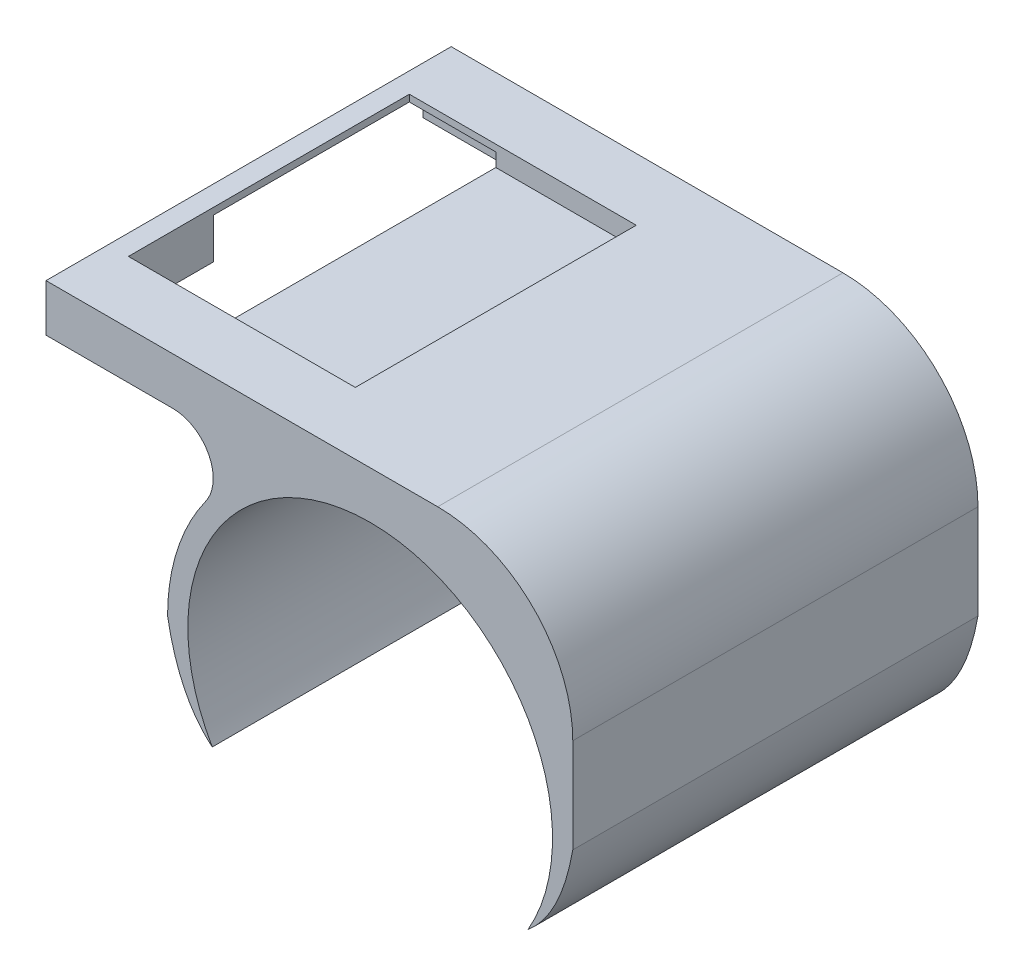
ISO-10303-21;
HEADER;
FILE_DESCRIPTION(('STEP AP214'),'2;1');
FILE_NAME('part.step','',(''),(''),'','','');
FILE_SCHEMA(('AUTOMOTIVE_DESIGN { 1 0 10303 214 1 1 1 1 }'));
ENDSEC;
DATA;
#1=APPLICATION_CONTEXT('core data for automotive mechanical design processes');
#2=APPLICATION_PROTOCOL_DEFINITION('international standard','automotive_design',2000,#1);
#3=PRODUCT_CONTEXT('',#1,'mechanical');
#4=PRODUCT('Part','Part','',(#3));
#5=PRODUCT_RELATED_PRODUCT_CATEGORY('part','',(#4));
#6=PRODUCT_DEFINITION_FORMATION('','',#4);
#7=PRODUCT_DEFINITION_CONTEXT('part definition',#1,'design');
#8=PRODUCT_DEFINITION('design','',#6,#7);
#9=PRODUCT_DEFINITION_SHAPE('','',#8);
#10=(LENGTH_UNIT() NAMED_UNIT(*) SI_UNIT(.MILLI.,.METRE.));
#11=(NAMED_UNIT(*) PLANE_ANGLE_UNIT() SI_UNIT($,.RADIAN.));
#12=(NAMED_UNIT(*) SI_UNIT($,.STERADIAN.) SOLID_ANGLE_UNIT());
#13=UNCERTAINTY_MEASURE_WITH_UNIT(LENGTH_MEASURE(1.E-05),#10,'distance_accuracy_value','');
#14=(GEOMETRIC_REPRESENTATION_CONTEXT(3) GLOBAL_UNCERTAINTY_ASSIGNED_CONTEXT((#13)) GLOBAL_UNIT_ASSIGNED_CONTEXT((#10,
#11,#12)) REPRESENTATION_CONTEXT('',''));
#15=CARTESIAN_POINT('',(0.,0.,0.));
#16=DIRECTION('',(0.,0.,1.));
#17=DIRECTION('',(1.,0.,0.));
#18=AXIS2_PLACEMENT_3D('',#15,#16,#17);
#19=CARTESIAN_POINT('',(-24.,0.,0.));
#20=DIRECTION('',(-1.,0.,0.));
#21=DIRECTION('',(0.,0.,1.));
#22=AXIS2_PLACEMENT_3D('',#19,#20,#21);
#23=PLANE('',#22);
#24=DIRECTION('',(0.,0.,1.));
#25=VECTOR('',#24,1.);
#26=CARTESIAN_POINT('',(-24.,13.5,0.));
#27=LINE('',#26,#25);
#28=CARTESIAN_POINT('',(-24.,13.5,0.));
#29=VERTEX_POINT('',#28);
#30=CARTESIAN_POINT('',(-24.,13.5,2.1));
#31=VERTEX_POINT('',#30);
#32=EDGE_CURVE('E263',#29,#31,#27,.T.);
#33=ORIENTED_EDGE('',*,*,#32,.T.);
#34=DIRECTION('',(0.,-1.,0.));
#35=VECTOR('',#34,1.);
#36=CARTESIAN_POINT('',(-24.,16.5,2.1));
#37=LINE('',#36,#35);
#38=CARTESIAN_POINT('',(-24.,16.5,2.1));
#39=VERTEX_POINT('',#38);
#40=EDGE_CURVE('E210',#39,#31,#37,.T.);
#41=ORIENTED_EDGE('',*,*,#40,.F.);
#42=DIRECTION('',(0.,0.,-1.));
#43=VECTOR('',#42,1.);
#44=CARTESIAN_POINT('',(-24.,16.5,0.));
#45=LINE('',#44,#43);
#46=CARTESIAN_POINT('',(-24.,16.5,19.1));
#47=VERTEX_POINT('',#46);
#48=EDGE_CURVE('E193',#47,#39,#45,.T.);
#49=ORIENTED_EDGE('',*,*,#48,.F.);
#50=DIRECTION('',(0.,-1.,0.));
#51=VECTOR('',#50,1.);
#52=CARTESIAN_POINT('',(-24.,16.5,19.1));
#53=LINE('',#52,#51);
#54=CARTESIAN_POINT('',(-24.,13.5,19.1));
#55=VERTEX_POINT('',#54);
#56=EDGE_CURVE('E213',#47,#55,#53,.T.);
#57=ORIENTED_EDGE('',*,*,#56,.T.);
#58=CARTESIAN_POINT('',(-24.,13.5,30.));
#59=VERTEX_POINT('',#58);
#60=EDGE_CURVE('E262',#55,#59,#27,.T.);
#61=ORIENTED_EDGE('',*,*,#60,.T.);
#62=DIRECTION('',(0.,1.,0.));
#63=VECTOR('',#62,1.);
#64=CARTESIAN_POINT('',(-24.,17.,30.));
#65=LINE('',#64,#63);
#66=CARTESIAN_POINT('',(-24.,17.,30.));
#67=VERTEX_POINT('',#66);
#68=EDGE_CURVE('E266',#59,#67,#65,.T.);
#69=ORIENTED_EDGE('',*,*,#68,.T.);
#70=DIRECTION('',(0.,0.,-1.));
#71=VECTOR('',#70,1.);
#72=CARTESIAN_POINT('',(-24.,17.,0.));
#73=LINE('',#72,#71);
#74=CARTESIAN_POINT('',(-24.,17.,0.));
#75=VERTEX_POINT('',#74);
#76=EDGE_CURVE('E269',#67,#75,#73,.T.);
#77=ORIENTED_EDGE('',*,*,#76,.T.);
#78=DIRECTION('',(0.,-1.,0.));
#79=VECTOR('',#78,1.);
#80=CARTESIAN_POINT('',(-24.,17.,0.));
#81=LINE('',#80,#79);
#82=EDGE_CURVE('E259',#75,#29,#81,.T.);
#83=ORIENTED_EDGE('',*,*,#82,.T.);
#84=EDGE_LOOP('',(#33,#41,#49,#57,#61,#69,#77,#83));
#85=FACE_BOUND('',#84,.T.);
#86=ADVANCED_FACE('F41',(#85),#23,.T.);
#87=CARTESIAN_POINT('',(0.,0.,4.6));
#88=DIRECTION('',(0.,0.,1.));
#89=DIRECTION('',(1.,0.,0.));
#90=AXIS2_PLACEMENT_3D('',#87,#88,#89);
#91=PLANE('',#90);
#92=DIRECTION('',(-1.,0.,0.));
#93=VECTOR('',#92,1.);
#94=CARTESIAN_POINT('',(0.,16.5,4.6));
#95=LINE('',#94,#93);
#96=CARTESIAN_POINT('',(-16.1,16.5,4.6));
#97=VERTEX_POINT('',#96);
#98=CARTESIAN_POINT('',(-22.5,16.5,4.6));
#99=VERTEX_POINT('',#98);
#100=EDGE_CURVE('E56',#97,#99,#95,.T.);
#101=ORIENTED_EDGE('',*,*,#100,.F.);
#102=DIRECTION('',(0.,-1.,0.));
#103=VECTOR('',#102,1.);
#104=CARTESIAN_POINT('',(-16.1,16.5,4.6));
#105=LINE('',#104,#103);
#106=CARTESIAN_POINT('',(-16.1,15.5,4.6));
#107=VERTEX_POINT('',#106);
#108=EDGE_CURVE('E184',#97,#107,#105,.T.);
#109=ORIENTED_EDGE('',*,*,#108,.T.);
#110=DIRECTION('',(1.,0.,0.));
#111=VECTOR('',#110,1.);
#112=CARTESIAN_POINT('',(-16.1,15.5,4.6));
#113=LINE('',#112,#111);
#114=CARTESIAN_POINT('',(-5.7,15.5,4.6));
#115=VERTEX_POINT('',#114);
#116=EDGE_CURVE('E229',#107,#115,#113,.T.);
#117=ORIENTED_EDGE('',*,*,#116,.T.);
#118=DIRECTION('',(0.,1.,0.));
#119=VECTOR('',#118,1.);
#120=CARTESIAN_POINT('',(-5.7,15.5,4.6));
#121=LINE('',#120,#119);
#122=CARTESIAN_POINT('',(-5.7,17.,4.6));
#123=VERTEX_POINT('',#122);
#124=EDGE_CURVE('E232',#115,#123,#121,.T.);
#125=ORIENTED_EDGE('',*,*,#124,.T.);
#126=DIRECTION('',(-1.,0.,0.));
#127=VECTOR('',#126,1.);
#128=CARTESIAN_POINT('',(-5.7,17.,4.6));
#129=LINE('',#128,#127);
#130=CARTESIAN_POINT('',(-22.5,17.,4.6));
#131=VERTEX_POINT('',#130);
#132=EDGE_CURVE('E235',#123,#131,#129,.T.);
#133=ORIENTED_EDGE('',*,*,#132,.T.);
#134=DIRECTION('',(0.,1.,0.));
#135=VECTOR('',#134,1.);
#136=CARTESIAN_POINT('',(-22.5,17.,4.6));
#137=LINE('',#136,#135);
#138=EDGE_CURVE('E224',#99,#131,#137,.T.);
#139=ORIENTED_EDGE('',*,*,#138,.F.);
#140=EDGE_LOOP('',(#101,#109,#117,#125,#133,#139));
#141=FACE_BOUND('',#140,.T.);
#142=ADVANCED_FACE('F329',(#141),#91,.T.);
#143=CARTESIAN_POINT('',(0.,15.5,0.));
#144=DIRECTION('',(0.,1.,0.));
#145=DIRECTION('',(0.,0.,1.));
#146=AXIS2_PLACEMENT_3D('',#143,#144,#145);
#147=PLANE('',#146);
#148=DIRECTION('',(0.,0.,-1.));
#149=VECTOR('',#148,1.);
#150=CARTESIAN_POINT('',(-16.1,15.5,4.9));
#151=LINE('',#150,#149);
#152=CARTESIAN_POINT('',(-16.1,15.5,25.4));
#153=VERTEX_POINT('',#152);
#154=EDGE_CURVE('E253',#153,#107,#151,.T.);
#155=ORIENTED_EDGE('',*,*,#154,.F.);
#156=DIRECTION('',(-1.,0.,0.));
#157=VECTOR('',#156,1.);
#158=CARTESIAN_POINT('',(-5.7,15.5,25.4));
#159=LINE('',#158,#157);
#160=CARTESIAN_POINT('',(-5.7,15.5,25.4));
#161=VERTEX_POINT('',#160);
#162=EDGE_CURVE('E241',#161,#153,#159,.T.);
#163=ORIENTED_EDGE('',*,*,#162,.F.);
#164=DIRECTION('',(0.,0.,1.));
#165=VECTOR('',#164,1.);
#166=CARTESIAN_POINT('',(-5.7,15.5,4.4));
#167=LINE('',#166,#165);
#168=EDGE_CURVE('E255',#115,#161,#167,.T.);
#169=ORIENTED_EDGE('',*,*,#168,.F.);
#170=ORIENTED_EDGE('',*,*,#116,.F.);
#171=EDGE_LOOP('',(#155,#163,#169,#170));
#172=FACE_BOUND('',#171,.T.);
#173=ADVANCED_FACE('F335',(#172),#147,.T.);
#174=CARTESIAN_POINT('',(-5.7,0.,0.));
#175=DIRECTION('',(-1.,0.,0.));
#176=DIRECTION('',(0.,0.,1.));
#177=AXIS2_PLACEMENT_3D('',#174,#175,#176);
#178=PLANE('',#177);
#179=ORIENTED_EDGE('',*,*,#168,.T.);
#180=DIRECTION('',(0.,-1.,0.));
#181=VECTOR('',#180,1.);
#182=CARTESIAN_POINT('',(-5.7,17.,25.4));
#183=LINE('',#182,#181);
#184=CARTESIAN_POINT('',(-5.7,17.,25.4));
#185=VERTEX_POINT('',#184);
#186=EDGE_CURVE('E238',#185,#161,#183,.T.);
#187=ORIENTED_EDGE('',*,*,#186,.F.);
#188=DIRECTION('',(0.,0.,-1.));
#189=VECTOR('',#188,1.);
#190=CARTESIAN_POINT('',(-5.7,17.,4.4));
#191=LINE('',#190,#189);
#192=EDGE_CURVE('E257',#185,#123,#191,.T.);
#193=ORIENTED_EDGE('',*,*,#192,.T.);
#194=ORIENTED_EDGE('',*,*,#124,.F.);
#195=EDGE_LOOP('',(#179,#187,#193,#194));
#196=FACE_BOUND('',#195,.T.);
#197=ADVANCED_FACE('F339',(#196),#178,.T.);
#198=CARTESIAN_POINT('',(0.,0.,30.));
#199=DIRECTION('',(0.,0.,-1.));
#200=DIRECTION('',(-1.,0.,0.));
#201=AXIS2_PLACEMENT_3D('',#198,#199,#200);
#202=CYLINDRICAL_SURFACE('',#201,13.5);
#203=DIRECTION('',(0.,0.,-1.));
#204=VECTOR('',#203,1.);
#205=CARTESIAN_POINT('',(-11.6913429510903,-6.74999999999942,30.));
#206=LINE('',#205,#204);
#207=CARTESIAN_POINT('',(-11.6913429510903,-6.74999999999942,30.));
#208=VERTEX_POINT('',#207);
#209=CARTESIAN_POINT('',(-11.6913429510903,-6.74999999999942,0.));
#210=VERTEX_POINT('',#209);
#211=EDGE_CURVE('E389',#208,#210,#206,.T.);
#212=ORIENTED_EDGE('',*,*,#211,.T.);
#213=CARTESIAN_POINT('',(0.,0.,0.));
#214=DIRECTION('',(0.,0.,1.));
#215=DIRECTION('',(1.,0.,0.));
#216=AXIS2_PLACEMENT_3D('',#213,#214,#215);
#217=CIRCLE('',#216,13.5);
#218=CARTESIAN_POINT('',(11.6913429510903,-6.74999999999942,0.));
#219=VERTEX_POINT('',#218);
#220=EDGE_CURVE('E373',#219,#210,#217,.T.);
#221=ORIENTED_EDGE('',*,*,#220,.F.);
#222=DIRECTION('',(0.,0.,-1.));
#223=VECTOR('',#222,1.);
#224=CARTESIAN_POINT('',(11.6913429510903,-6.74999999999942,30.));
#225=LINE('',#224,#223);
#226=CARTESIAN_POINT('',(11.6913429510903,-6.74999999999942,30.));
#227=VERTEX_POINT('',#226);
#228=EDGE_CURVE('E387',#227,#219,#225,.T.);
#229=ORIENTED_EDGE('',*,*,#228,.F.);
#230=CARTESIAN_POINT('',(0.,0.,30.));
#231=DIRECTION('',(0.,0.,1.));
#232=DIRECTION('',(1.,0.,0.));
#233=AXIS2_PLACEMENT_3D('',#230,#231,#232);
#234=CIRCLE('',#233,13.5);
#235=EDGE_CURVE('E294',#227,#208,#234,.T.);
#236=ORIENTED_EDGE('',*,*,#235,.T.);
#237=EDGE_LOOP('',(#212,#221,#229,#236));
#238=FACE_BOUND('',#237,.T.);
#239=ADVANCED_FACE('F307',(#238),#202,.F.);
#240=CARTESIAN_POINT('',(0.,17.,0.));
#241=DIRECTION('',(0.,1.,0.));
#242=DIRECTION('',(0.,0.,1.));
#243=AXIS2_PLACEMENT_3D('',#240,#241,#242);
#244=PLANE('',#243);
#245=DIRECTION('',(1.,0.,0.));
#246=VECTOR('',#245,1.);
#247=CARTESIAN_POINT('',(-22.3,17.,25.4));
#248=LINE('',#247,#246);
#249=CARTESIAN_POINT('',(-22.5,17.,25.4));
#250=VERTEX_POINT('',#249);
#251=EDGE_CURVE('E249',#250,#185,#248,.T.);
#252=ORIENTED_EDGE('',*,*,#251,.F.);
#253=DIRECTION('',(0.,0.,1.));
#254=VECTOR('',#253,1.);
#255=CARTESIAN_POINT('',(-22.5,17.,25.4));
#256=LINE('',#255,#254);
#257=EDGE_CURVE('E226',#131,#250,#256,.T.);
#258=ORIENTED_EDGE('',*,*,#257,.F.);
#259=ORIENTED_EDGE('',*,*,#132,.F.);
#260=ORIENTED_EDGE('',*,*,#192,.F.);
#261=EDGE_LOOP('',(#252,#258,#259,#260));
#262=FACE_BOUND('',#261,.T.);
#263=DIRECTION('',(1.,0.,0.));
#264=VECTOR('',#263,1.);
#265=CARTESIAN_POINT('',(-20.,17.,30.));
#266=LINE('',#265,#264);
#267=CARTESIAN_POINT('',(5.,17.,30.));
#268=VERTEX_POINT('',#267);
#269=EDGE_CURVE('E277',#67,#268,#266,.T.);
#270=ORIENTED_EDGE('',*,*,#269,.T.);
#271=DIRECTION('',(0.,0.,1.));
#272=VECTOR('',#271,1.);
#273=CARTESIAN_POINT('',(5.,17.,0.));
#274=LINE('',#273,#272);
#275=CARTESIAN_POINT('',(5.,17.,0.));
#276=VERTEX_POINT('',#275);
#277=EDGE_CURVE('E49',#268,#276,#274,.F.);
#278=ORIENTED_EDGE('',*,*,#277,.T.);
#279=DIRECTION('',(-1.,0.,0.));
#280=VECTOR('',#279,1.);
#281=CARTESIAN_POINT('',(-20.,17.,0.));
#282=LINE('',#281,#280);
#283=EDGE_CURVE('E279',#276,#75,#282,.T.);
#284=ORIENTED_EDGE('',*,*,#283,.T.);
#285=ORIENTED_EDGE('',*,*,#76,.F.);
#286=EDGE_LOOP('',(#270,#278,#284,#285));
#287=FACE_BOUND('',#286,.T.);
#288=ADVANCED_FACE('F342',(#262,#287),#244,.T.);
#289=CARTESIAN_POINT('',(0.,0.,30.));
#290=DIRECTION('',(0.,0.,1.));
#291=DIRECTION('',(1.,0.,0.));
#292=AXIS2_PLACEMENT_3D('',#289,#290,#291);
#293=PLANE('',#292);
#294=CARTESIAN_POINT('',(-15.,0.,30.));
#295=CARTESIAN_POINT('',(-12.8770799213865,-11.9990007211776,30.));
#296=CARTESIAN_POINT('',(0.,-6.75,30.));
#297=B_SPLINE_CURVE_WITH_KNOTS('',2,(#294,#295,#296),.UNSPECIFIED.,.F.,.F.,(3,3),(0.,1.),.UNSPECIFIED.);
#298=CARTESIAN_POINT('',(-15.,0.,30.));
#299=VERTEX_POINT('',#298);
#300=EDGE_CURVE('E288',#299,#208,#297,.T.);
#301=ORIENTED_EDGE('',*,*,#300,.T.);
#302=ORIENTED_EDGE('',*,*,#235,.F.);
#303=CARTESIAN_POINT('',(15.,0.,30.));
#304=CARTESIAN_POINT('',(12.8770799213865,-11.9990007211776,30.));
#305=CARTESIAN_POINT('',(0.,-6.75,30.));
#306=B_SPLINE_CURVE_WITH_KNOTS('',2,(#303,#304,#305),.UNSPECIFIED.,.F.,.F.,(3,3),(0.,1.),.UNSPECIFIED.);
#307=CARTESIAN_POINT('',(15.,0.,30.));
#308=VERTEX_POINT('',#307);
#309=EDGE_CURVE('E355',#308,#227,#306,.T.);
#310=ORIENTED_EDGE('',*,*,#309,.F.);
#311=DIRECTION('',(0.,-1.,0.));
#312=VECTOR('',#311,1.);
#313=CARTESIAN_POINT('',(15.,17.,30.));
#314=LINE('',#313,#312);
#315=CARTESIAN_POINT('',(15.,7.,30.));
#316=VERTEX_POINT('',#315);
#317=EDGE_CURVE('E272',#316,#308,#314,.T.);
#318=ORIENTED_EDGE('',*,*,#317,.F.);
#319=CARTESIAN_POINT('',(5.,7.,30.));
#320=DIRECTION('',(0.,0.,1.));
#321=DIRECTION('',(1.,0.,0.));
#322=AXIS2_PLACEMENT_3D('',#319,#320,#321);
#323=CIRCLE('',#322,10.);
#324=EDGE_CURVE('E407',#316,#268,#323,.T.);
#325=ORIENTED_EDGE('',*,*,#324,.T.);
#326=ORIENTED_EDGE('',*,*,#269,.F.);
#327=ORIENTED_EDGE('',*,*,#68,.F.);
#328=DIRECTION('',(-1.,0.,0.));
#329=VECTOR('',#328,1.);
#330=CARTESIAN_POINT('',(0.,13.5,30.));
#331=LINE('',#330,#329);
#332=CARTESIAN_POINT('',(-14.6201915172134,13.5,30.));
#333=VERTEX_POINT('',#332);
#334=EDGE_CURVE('E282',#333,#59,#331,.T.);
#335=ORIENTED_EDGE('',*,*,#334,.F.);
#336=CARTESIAN_POINT('',(-14.6201915172134,10.5,30.));
#337=DIRECTION('',(0.,0.,1.));
#338=DIRECTION('',(1.,0.,0.));
#339=AXIS2_PLACEMENT_3D('',#336,#337,#338);
#340=CIRCLE('',#339,3.);
#341=CARTESIAN_POINT('',(-12.1834929310112,8.75,30.));
#342=VERTEX_POINT('',#341);
#343=EDGE_CURVE('E402',#333,#342,#340,.F.);
#344=ORIENTED_EDGE('',*,*,#343,.T.);
#345=CARTESIAN_POINT('',(0.,0.,30.));
#346=DIRECTION('',(0.,0.,1.));
#347=DIRECTION('',(1.,0.,0.));
#348=AXIS2_PLACEMENT_3D('',#345,#346,#347);
#349=CIRCLE('',#348,15.);
#350=EDGE_CURVE('E285',#342,#299,#349,.T.);
#351=ORIENTED_EDGE('',*,*,#350,.T.);
#352=EDGE_LOOP('',(#301,#302,#310,#318,#325,#326,#327,#335,#344,#351));
#353=FACE_BOUND('',#352,.T.);
#354=ADVANCED_FACE('F345',(#353),#293,.T.);
#355=CARTESIAN_POINT('',(0.,0.,0.));
#356=DIRECTION('',(0.,0.,1.));
#357=DIRECTION('',(1.,0.,0.));
#358=AXIS2_PLACEMENT_3D('',#355,#356,#357);
#359=PLANE('',#358);
#360=ORIENTED_EDGE('',*,*,#220,.T.);
#361=CARTESIAN_POINT('',(-15.,0.,0.));
#362=CARTESIAN_POINT('',(-12.8770799213865,-11.9990007211776,0.));
#363=CARTESIAN_POINT('',(0.,-6.75,0.));
#364=B_SPLINE_CURVE_WITH_KNOTS('',2,(#361,#362,#363),.UNSPECIFIED.,.F.,.F.,(3,3),(0.,1.),.UNSPECIFIED.);
#365=CARTESIAN_POINT('',(-15.,0.,0.));
#366=VERTEX_POINT('',#365);
#367=EDGE_CURVE('E368',#366,#210,#364,.T.);
#368=ORIENTED_EDGE('',*,*,#367,.F.);
#369=CARTESIAN_POINT('',(0.,0.,0.));
#370=DIRECTION('',(0.,0.,1.));
#371=DIRECTION('',(1.,0.,0.));
#372=AXIS2_PLACEMENT_3D('',#369,#370,#371);
#373=CIRCLE('',#372,15.);
#374=CARTESIAN_POINT('',(-12.1834929310112,8.75,0.));
#375=VERTEX_POINT('',#374);
#376=EDGE_CURVE('E366',#375,#366,#373,.T.);
#377=ORIENTED_EDGE('',*,*,#376,.F.);
#378=CARTESIAN_POINT('',(-14.6201915172134,10.5,0.));
#379=DIRECTION('',(0.,0.,1.));
#380=DIRECTION('',(1.,0.,0.));
#381=AXIS2_PLACEMENT_3D('',#378,#379,#380);
#382=CIRCLE('',#381,3.);
#383=CARTESIAN_POINT('',(-14.6201915172134,13.5,0.));
#384=VERTEX_POINT('',#383);
#385=EDGE_CURVE('E400',#375,#384,#382,.T.);
#386=ORIENTED_EDGE('',*,*,#385,.T.);
#387=DIRECTION('',(-1.,0.,0.));
#388=VECTOR('',#387,1.);
#389=CARTESIAN_POINT('',(0.,13.5,0.));
#390=LINE('',#389,#388);
#391=EDGE_CURVE('E281',#384,#29,#390,.T.);
#392=ORIENTED_EDGE('',*,*,#391,.T.);
#393=ORIENTED_EDGE('',*,*,#82,.F.);
#394=ORIENTED_EDGE('',*,*,#283,.F.);
#395=CARTESIAN_POINT('',(5.,7.,0.));
#396=DIRECTION('',(0.,0.,1.));
#397=DIRECTION('',(1.,0.,0.));
#398=AXIS2_PLACEMENT_3D('',#395,#396,#397);
#399=CIRCLE('',#398,10.);
#400=CARTESIAN_POINT('',(15.,7.,0.));
#401=VERTEX_POINT('',#400);
#402=EDGE_CURVE('E11',#276,#401,#399,.F.);
#403=ORIENTED_EDGE('',*,*,#402,.T.);
#404=DIRECTION('',(0.,1.,0.));
#405=VECTOR('',#404,1.);
#406=CARTESIAN_POINT('',(15.,17.,0.));
#407=LINE('',#406,#405);
#408=CARTESIAN_POINT('',(15.,0.,0.));
#409=VERTEX_POINT('',#408);
#410=EDGE_CURVE('E274',#409,#401,#407,.T.);
#411=ORIENTED_EDGE('',*,*,#410,.F.);
#412=CARTESIAN_POINT('',(15.,0.,0.));
#413=CARTESIAN_POINT('',(12.8770799213865,-11.9990007211776,0.));
#414=CARTESIAN_POINT('',(0.,-6.75,0.));
#415=B_SPLINE_CURVE_WITH_KNOTS('',2,(#412,#413,#414),.UNSPECIFIED.,.F.,.F.,(3,3),(0.,1.),.UNSPECIFIED.);
#416=EDGE_CURVE('E286',#409,#219,#415,.T.);
#417=ORIENTED_EDGE('',*,*,#416,.T.);
#418=EDGE_LOOP('',(#360,#368,#377,#386,#392,#393,#394,#403,#411,#417));
#419=FACE_BOUND('',#418,.T.);
#420=ADVANCED_FACE('F314',(#419),#359,.F.);
#421=CARTESIAN_POINT('',(0.,13.5,30.));
#422=DIRECTION('',(0.,-1.,0.));
#423=DIRECTION('',(0.,0.,-1.));
#424=AXIS2_PLACEMENT_3D('',#421,#422,#423);
#425=PLANE('',#424);
#426=DIRECTION('',(-1.,0.,0.));
#427=VECTOR('',#426,1.);
#428=CARTESIAN_POINT('',(0.,13.5,19.1));
#429=LINE('',#428,#427);
#430=CARTESIAN_POINT('',(-22.5,13.5,19.1));
#431=VERTEX_POINT('',#430);
#432=EDGE_CURVE('E199',#431,#55,#429,.T.);
#433=ORIENTED_EDGE('',*,*,#432,.F.);
#434=DIRECTION('',(0.,0.,-1.));
#435=VECTOR('',#434,1.);
#436=CARTESIAN_POINT('',(-22.5,13.5,25.4));
#437=LINE('',#436,#435);
#438=CARTESIAN_POINT('',(-22.5,13.5,25.4));
#439=VERTEX_POINT('',#438);
#440=EDGE_CURVE('E221',#439,#431,#437,.T.);
#441=ORIENTED_EDGE('',*,*,#440,.F.);
#442=DIRECTION('',(-1.,0.,0.));
#443=VECTOR('',#442,1.);
#444=CARTESIAN_POINT('',(-16.1,13.5,25.4));
#445=LINE('',#444,#443);
#446=CARTESIAN_POINT('',(-16.1,13.5,25.4));
#447=VERTEX_POINT('',#446);
#448=EDGE_CURVE('E247',#447,#439,#445,.T.);
#449=ORIENTED_EDGE('',*,*,#448,.F.);
#450=DIRECTION('',(0.,0.,1.));
#451=VECTOR('',#450,1.);
#452=CARTESIAN_POINT('',(-16.1,13.5,4.9));
#453=LINE('',#452,#451);
#454=CARTESIAN_POINT('',(-16.1,13.5,2.1));
#455=VERTEX_POINT('',#454);
#456=EDGE_CURVE('E251',#455,#447,#453,.T.);
#457=ORIENTED_EDGE('',*,*,#456,.F.);
#458=DIRECTION('',(-1.,0.,0.));
#459=VECTOR('',#458,1.);
#460=CARTESIAN_POINT('',(0.,13.5,2.1));
#461=LINE('',#460,#459);
#462=EDGE_CURVE('E192',#455,#31,#461,.T.);
#463=ORIENTED_EDGE('',*,*,#462,.T.);
#464=ORIENTED_EDGE('',*,*,#32,.F.);
#465=ORIENTED_EDGE('',*,*,#391,.F.);
#466=DIRECTION('',(0.,0.,-1.));
#467=VECTOR('',#466,1.);
#468=CARTESIAN_POINT('',(-14.6201915172134,13.5,30.));
#469=LINE('',#468,#467);
#470=EDGE_CURVE('E398',#384,#333,#469,.F.);
#471=ORIENTED_EDGE('',*,*,#470,.T.);
#472=ORIENTED_EDGE('',*,*,#334,.T.);
#473=ORIENTED_EDGE('',*,*,#60,.F.);
#474=EDGE_LOOP('',(#433,#441,#449,#457,#463,#464,#465,#471,#472,#473));
#475=FACE_BOUND('',#474,.T.);
#476=ADVANCED_FACE('F311',(#475),#425,.T.);
#477=CARTESIAN_POINT('',(0.,0.,30.));
#478=DIRECTION('',(0.,0.,-1.));
#479=DIRECTION('',(-1.,0.,0.));
#480=AXIS2_PLACEMENT_3D('',#477,#478,#479);
#481=CYLINDRICAL_SURFACE('',#480,15.);
#482=ORIENTED_EDGE('',*,*,#350,.F.);
#483=DIRECTION('',(0.,0.,-1.));
#484=VECTOR('',#483,1.);
#485=CARTESIAN_POINT('',(-12.1834929310112,8.75,30.));
#486=LINE('',#485,#484);
#487=EDGE_CURVE('E395',#342,#375,#486,.T.);
#488=ORIENTED_EDGE('',*,*,#487,.T.);
#489=ORIENTED_EDGE('',*,*,#376,.T.);
#490=DIRECTION('',(0.,0.,-1.));
#491=VECTOR('',#490,1.);
#492=CARTESIAN_POINT('',(-15.,0.,30.));
#493=LINE('',#492,#491);
#494=EDGE_CURVE('E392',#299,#366,#493,.T.);
#495=ORIENTED_EDGE('',*,*,#494,.F.);
#496=EDGE_LOOP('',(#482,#488,#489,#495));
#497=FACE_BOUND('',#496,.T.);
#498=ADVANCED_FACE('F305',(#497),#481,.T.);
#499=DIRECTION('',(0.,0.,-1.));
#500=VECTOR('',#499,1.);
#501=SURFACE_OF_LINEAR_EXTRUSION('',#297,#500);
#502=ORIENTED_EDGE('',*,*,#367,.T.);
#503=ORIENTED_EDGE('',*,*,#211,.F.);
#504=ORIENTED_EDGE('',*,*,#300,.F.);
#505=ORIENTED_EDGE('',*,*,#494,.T.);
#506=EDGE_LOOP('',(#502,#503,#504,#505));
#507=FACE_BOUND('',#506,.T.);
#508=ADVANCED_FACE('F300',(#507),#501,.F.);
#509=DIRECTION('',(0.,0.,-1.));
#510=VECTOR('',#509,1.);
#511=SURFACE_OF_LINEAR_EXTRUSION('',#306,#510);
#512=ORIENTED_EDGE('',*,*,#416,.F.);
#513=DIRECTION('',(0.,0.,-1.));
#514=VECTOR('',#513,1.);
#515=CARTESIAN_POINT('',(15.,0.,30.));
#516=LINE('',#515,#514);
#517=EDGE_CURVE('E361',#308,#409,#516,.T.);
#518=ORIENTED_EDGE('',*,*,#517,.F.);
#519=ORIENTED_EDGE('',*,*,#309,.T.);
#520=ORIENTED_EDGE('',*,*,#228,.T.);
#521=EDGE_LOOP('',(#512,#518,#519,#520));
#522=FACE_BOUND('',#521,.T.);
#523=ADVANCED_FACE('F304',(#522),#511,.T.);
#524=CARTESIAN_POINT('',(-14.6201915172134,10.5,30.));
#525=DIRECTION('',(0.,0.,-1.));
#526=DIRECTION('',(-1.,0.,0.));
#527=AXIS2_PLACEMENT_3D('',#524,#525,#526);
#528=CYLINDRICAL_SURFACE('',#527,3.);
#529=ORIENTED_EDGE('',*,*,#343,.F.);
#530=ORIENTED_EDGE('',*,*,#470,.F.);
#531=ORIENTED_EDGE('',*,*,#385,.F.);
#532=ORIENTED_EDGE('',*,*,#487,.F.);
#533=EDGE_LOOP('',(#529,#530,#531,#532));
#534=FACE_BOUND('',#533,.T.);
#535=ADVANCED_FACE('F316',(#534),#528,.F.);
#536=CARTESIAN_POINT('',(15.,0.,0.));
#537=DIRECTION('',(1.,0.,0.));
#538=DIRECTION('',(0.,0.,-1.));
#539=AXIS2_PLACEMENT_3D('',#536,#537,#538);
#540=PLANE('',#539);
#541=ORIENTED_EDGE('',*,*,#410,.T.);
#542=DIRECTION('',(0.,0.,1.));
#543=VECTOR('',#542,1.);
#544=CARTESIAN_POINT('',(15.,7.,0.));
#545=LINE('',#544,#543);
#546=EDGE_CURVE('E404',#401,#316,#545,.T.);
#547=ORIENTED_EDGE('',*,*,#546,.T.);
#548=ORIENTED_EDGE('',*,*,#317,.T.);
#549=ORIENTED_EDGE('',*,*,#517,.T.);
#550=EDGE_LOOP('',(#541,#547,#548,#549));
#551=FACE_BOUND('',#550,.T.);
#552=ADVANCED_FACE('F318',(#551),#540,.T.);
#553=CARTESIAN_POINT('',(5.,7.,0.));
#554=DIRECTION('',(0.,0.,1.));
#555=DIRECTION('',(1.,0.,0.));
#556=AXIS2_PLACEMENT_3D('',#553,#554,#555);
#557=CYLINDRICAL_SURFACE('',#556,10.);
#558=ORIENTED_EDGE('',*,*,#402,.F.);
#559=ORIENTED_EDGE('',*,*,#277,.F.);
#560=ORIENTED_EDGE('',*,*,#324,.F.);
#561=ORIENTED_EDGE('',*,*,#546,.F.);
#562=EDGE_LOOP('',(#558,#559,#560,#561));
#563=FACE_BOUND('',#562,.T.);
#564=ADVANCED_FACE('F43',(#563),#557,.T.);
#565=CARTESIAN_POINT('',(-16.1,0.,0.));
#566=DIRECTION('',(-1.,0.,0.));
#567=DIRECTION('',(0.,0.,1.));
#568=AXIS2_PLACEMENT_3D('',#565,#566,#567);
#569=PLANE('',#568);
#570=ORIENTED_EDGE('',*,*,#154,.T.);
#571=ORIENTED_EDGE('',*,*,#108,.F.);
#572=DIRECTION('',(0.,0.,-1.));
#573=VECTOR('',#572,1.);
#574=CARTESIAN_POINT('',(-16.1,16.5,0.));
#575=LINE('',#574,#573);
#576=CARTESIAN_POINT('',(-16.1,16.5,2.1));
#577=VERTEX_POINT('',#576);
#578=EDGE_CURVE('E178',#97,#577,#575,.T.);
#579=ORIENTED_EDGE('',*,*,#578,.T.);
#580=DIRECTION('',(0.,-1.,0.));
#581=VECTOR('',#580,1.);
#582=CARTESIAN_POINT('',(-16.1,16.5,2.1));
#583=LINE('',#582,#581);
#584=EDGE_CURVE('E182',#577,#455,#583,.T.);
#585=ORIENTED_EDGE('',*,*,#584,.T.);
#586=ORIENTED_EDGE('',*,*,#456,.T.);
#587=DIRECTION('',(0.,-1.,0.));
#588=VECTOR('',#587,1.);
#589=CARTESIAN_POINT('',(-16.1,15.5,25.4));
#590=LINE('',#589,#588);
#591=EDGE_CURVE('E244',#153,#447,#590,.T.);
#592=ORIENTED_EDGE('',*,*,#591,.F.);
#593=EDGE_LOOP('',(#570,#571,#579,#585,#586,#592));
#594=FACE_BOUND('',#593,.T.);
#595=ADVANCED_FACE('F181',(#594),#569,.T.);
#596=CARTESIAN_POINT('',(0.,0.,25.4));
#597=DIRECTION('',(0.,0.,-1.));
#598=DIRECTION('',(-1.,0.,0.));
#599=AXIS2_PLACEMENT_3D('',#596,#597,#598);
#600=PLANE('',#599);
#601=ORIENTED_EDGE('',*,*,#251,.T.);
#602=ORIENTED_EDGE('',*,*,#186,.T.);
#603=ORIENTED_EDGE('',*,*,#162,.T.);
#604=ORIENTED_EDGE('',*,*,#591,.T.);
#605=ORIENTED_EDGE('',*,*,#448,.T.);
#606=DIRECTION('',(0.,-1.,0.));
#607=VECTOR('',#606,1.);
#608=CARTESIAN_POINT('',(-22.5,17.,25.4));
#609=LINE('',#608,#607);
#610=EDGE_CURVE('E212',#250,#439,#609,.T.);
#611=ORIENTED_EDGE('',*,*,#610,.F.);
#612=EDGE_LOOP('',(#601,#602,#603,#604,#605,#611));
#613=FACE_BOUND('',#612,.T.);
#614=ADVANCED_FACE('F443',(#613),#600,.T.);
#615=CARTESIAN_POINT('',(-22.5,0.,0.));
#616=DIRECTION('',(1.,0.,0.));
#617=DIRECTION('',(0.,0.,-1.));
#618=AXIS2_PLACEMENT_3D('',#615,#616,#617);
#619=PLANE('',#618);
#620=DIRECTION('',(0.,-1.,0.));
#621=VECTOR('',#620,1.);
#622=CARTESIAN_POINT('',(-22.5,16.5,19.1));
#623=LINE('',#622,#621);
#624=CARTESIAN_POINT('',(-22.5,16.5,19.1));
#625=VERTEX_POINT('',#624);
#626=EDGE_CURVE('E216',#625,#431,#623,.T.);
#627=ORIENTED_EDGE('',*,*,#626,.F.);
#628=DIRECTION('',(0.,0.,1.));
#629=VECTOR('',#628,1.);
#630=CARTESIAN_POINT('',(-22.5,16.5,0.));
#631=LINE('',#630,#629);
#632=EDGE_CURVE('E204',#99,#625,#631,.T.);
#633=ORIENTED_EDGE('',*,*,#632,.F.);
#634=ORIENTED_EDGE('',*,*,#138,.T.);
#635=ORIENTED_EDGE('',*,*,#257,.T.);
#636=ORIENTED_EDGE('',*,*,#610,.T.);
#637=ORIENTED_EDGE('',*,*,#440,.T.);
#638=EDGE_LOOP('',(#627,#633,#634,#635,#636,#637));
#639=FACE_BOUND('',#638,.T.);
#640=ADVANCED_FACE('F439',(#639),#619,.T.);
#641=CARTESIAN_POINT('',(0.,16.5,2.1));
#642=DIRECTION('',(0.,0.,1.));
#643=DIRECTION('',(1.,0.,0.));
#644=AXIS2_PLACEMENT_3D('',#641,#642,#643);
#645=PLANE('',#644);
#646=ORIENTED_EDGE('',*,*,#462,.F.);
#647=ORIENTED_EDGE('',*,*,#584,.F.);
#648=DIRECTION('',(-1.,0.,0.));
#649=VECTOR('',#648,1.);
#650=CARTESIAN_POINT('',(0.,16.5,2.1));
#651=LINE('',#650,#649);
#652=EDGE_CURVE('E186',#577,#39,#651,.T.);
#653=ORIENTED_EDGE('',*,*,#652,.T.);
#654=ORIENTED_EDGE('',*,*,#40,.T.);
#655=EDGE_LOOP('',(#646,#647,#653,#654));
#656=FACE_BOUND('',#655,.T.);
#657=ADVANCED_FACE('F189',(#656),#645,.T.);
#658=CARTESIAN_POINT('',(0.,16.5,19.1));
#659=DIRECTION('',(0.,0.,1.));
#660=DIRECTION('',(1.,0.,0.));
#661=AXIS2_PLACEMENT_3D('',#658,#659,#660);
#662=PLANE('',#661);
#663=ORIENTED_EDGE('',*,*,#432,.T.);
#664=ORIENTED_EDGE('',*,*,#56,.F.);
#665=DIRECTION('',(-1.,0.,0.));
#666=VECTOR('',#665,1.);
#667=CARTESIAN_POINT('',(0.,16.5,19.1));
#668=LINE('',#667,#666);
#669=EDGE_CURVE('E206',#625,#47,#668,.T.);
#670=ORIENTED_EDGE('',*,*,#669,.F.);
#671=ORIENTED_EDGE('',*,*,#626,.T.);
#672=EDGE_LOOP('',(#663,#664,#670,#671));
#673=FACE_BOUND('',#672,.T.);
#674=ADVANCED_FACE('F452',(#673),#662,.F.);
#675=CARTESIAN_POINT('',(0.,16.5,0.));
#676=DIRECTION('',(0.,-1.,0.));
#677=DIRECTION('',(0.,0.,-1.));
#678=AXIS2_PLACEMENT_3D('',#675,#676,#677);
#679=PLANE('',#678);
#680=ORIENTED_EDGE('',*,*,#652,.F.);
#681=ORIENTED_EDGE('',*,*,#578,.F.);
#682=ORIENTED_EDGE('',*,*,#100,.T.);
#683=ORIENTED_EDGE('',*,*,#632,.T.);
#684=ORIENTED_EDGE('',*,*,#669,.T.);
#685=ORIENTED_EDGE('',*,*,#48,.T.);
#686=EDGE_LOOP('',(#680,#681,#682,#683,#684,#685));
#687=FACE_BOUND('',#686,.T.);
#688=ADVANCED_FACE('F195',(#687),#679,.T.);
#689=CLOSED_SHELL('',(#86,#142,#173,#197,#239,#288,#354,#420,#476,#498,#508,#523,#535,#552,#564,
#595,#614,#640,#657,#674,#688));
#690=MANIFOLD_SOLID_BREP('B2',#689);
#691=ADVANCED_BREP_SHAPE_REPRESENTATION('',(#18,#690),#14);
#692=SHAPE_DEFINITION_REPRESENTATION(#9,#691);
ENDSEC;
END-ISO-10303-21;
